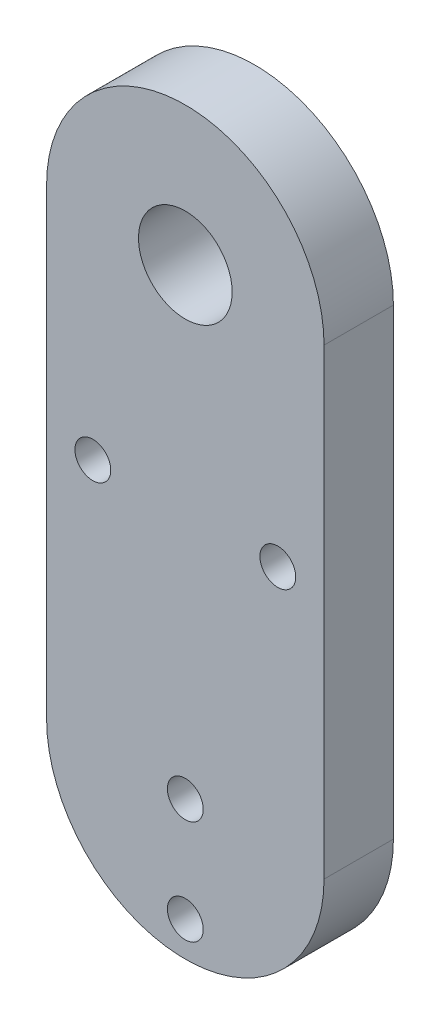
ISO-10303-21;
HEADER;
FILE_DESCRIPTION(('STEP AP214'),'2;1');
FILE_NAME('part.step','',(''),(''),'','','');
FILE_SCHEMA(('AUTOMOTIVE_DESIGN { 1 0 10303 214 1 1 1 1 }'));
ENDSEC;
DATA;
#1=APPLICATION_CONTEXT('core data for automotive mechanical design processes');
#2=APPLICATION_PROTOCOL_DEFINITION('international standard','automotive_design',2000,#1);
#3=PRODUCT_CONTEXT('',#1,'mechanical');
#4=PRODUCT('Part','Part','',(#3));
#5=PRODUCT_RELATED_PRODUCT_CATEGORY('part','',(#4));
#6=PRODUCT_DEFINITION_FORMATION('','',#4);
#7=PRODUCT_DEFINITION_CONTEXT('part definition',#1,'design');
#8=PRODUCT_DEFINITION('design','',#6,#7);
#9=PRODUCT_DEFINITION_SHAPE('','',#8);
#10=(LENGTH_UNIT() NAMED_UNIT(*) SI_UNIT(.MILLI.,.METRE.));
#11=(NAMED_UNIT(*) PLANE_ANGLE_UNIT() SI_UNIT($,.RADIAN.));
#12=(NAMED_UNIT(*) SI_UNIT($,.STERADIAN.) SOLID_ANGLE_UNIT());
#13=UNCERTAINTY_MEASURE_WITH_UNIT(LENGTH_MEASURE(1.E-05),#10,'distance_accuracy_value','');
#14=(GEOMETRIC_REPRESENTATION_CONTEXT(3) GLOBAL_UNCERTAINTY_ASSIGNED_CONTEXT((#13)) GLOBAL_UNIT_ASSIGNED_CONTEXT((#10,
#11,#12)) REPRESENTATION_CONTEXT('',''));
#15=CARTESIAN_POINT('',(0.,0.,0.));
#16=DIRECTION('',(0.,0.,1.));
#17=DIRECTION('',(1.,0.,0.));
#18=AXIS2_PLACEMENT_3D('',#15,#16,#17);
#19=CARTESIAN_POINT('',(-188.181077779291,116.924846476842,6.));
#20=DIRECTION('',(0.,0.,-1.));
#21=DIRECTION('',(-1.,0.,0.));
#22=AXIS2_PLACEMENT_3D('',#19,#20,#21);
#23=CYLINDRICAL_SURFACE('',#22,12.0000000000002);
#24=CARTESIAN_POINT('',(-188.181077779291,116.924846476842,0.));
#25=DIRECTION('',(0.,0.,1.));
#26=DIRECTION('',(1.,0.,0.));
#27=AXIS2_PLACEMENT_3D('',#24,#25,#26);
#28=CIRCLE('',#27,12.0000000000002);
#29=CARTESIAN_POINT('',(-176.181077779291,116.924844163406,0.));
#30=VERTEX_POINT('',#29);
#31=CARTESIAN_POINT('',(-200.181077779291,116.924844227523,0.));
#32=VERTEX_POINT('',#31);
#33=EDGE_CURVE('E99',#30,#32,#28,.T.);
#34=ORIENTED_EDGE('',*,*,#33,.T.);
#35=DIRECTION('',(0.,0.,-1.));
#36=VECTOR('',#35,1.);
#37=CARTESIAN_POINT('',(-200.181077779291,116.924844227523,6.));
#38=LINE('',#37,#36);
#39=CARTESIAN_POINT('',(-200.181077779291,116.924844227523,6.));
#40=VERTEX_POINT('',#39);
#41=EDGE_CURVE('E11',#40,#32,#38,.T.);
#42=ORIENTED_EDGE('',*,*,#41,.F.);
#43=CARTESIAN_POINT('',(-188.181077779291,116.924846476842,6.));
#44=DIRECTION('',(0.,0.,1.));
#45=DIRECTION('',(1.,0.,0.));
#46=AXIS2_PLACEMENT_3D('',#43,#44,#45);
#47=CIRCLE('',#46,12.0000000000002);
#48=CARTESIAN_POINT('',(-176.181077779291,116.924844163406,6.));
#49=VERTEX_POINT('',#48);
#50=EDGE_CURVE('E86',#49,#40,#47,.T.);
#51=ORIENTED_EDGE('',*,*,#50,.F.);
#52=DIRECTION('',(0.,0.,-1.));
#53=VECTOR('',#52,1.);
#54=CARTESIAN_POINT('',(-176.181077779291,116.924844163406,6.));
#55=LINE('',#54,#53);
#56=EDGE_CURVE('E95',#49,#30,#55,.T.);
#57=ORIENTED_EDGE('',*,*,#56,.T.);
#58=EDGE_LOOP('',(#34,#42,#51,#57));
#59=FACE_BOUND('',#58,.T.);
#60=ADVANCED_FACE('F34',(#59),#23,.T.);
#61=CARTESIAN_POINT('',(-200.181077779291,116.924844227523,6.));
#62=DIRECTION('',(1.,0.,0.));
#63=DIRECTION('',(0.,0.,-1.));
#64=AXIS2_PLACEMENT_3D('',#61,#62,#63);
#65=PLANE('',#64);
#66=DIRECTION('',(0.,-1.,0.));
#67=VECTOR('',#66,1.);
#68=CARTESIAN_POINT('',(-200.181077779291,116.924844227523,0.));
#69=LINE('',#68,#67);
#70=CARTESIAN_POINT('',(-200.181077779291,76.9248464768425,0.));
#71=VERTEX_POINT('',#70);
#72=EDGE_CURVE('E90',#32,#71,#69,.T.);
#73=ORIENTED_EDGE('',*,*,#72,.T.);
#74=DIRECTION('',(0.,0.,-1.));
#75=VECTOR('',#74,1.);
#76=CARTESIAN_POINT('',(-200.181077779291,76.9248464768425,6.));
#77=LINE('',#76,#75);
#78=CARTESIAN_POINT('',(-200.181077779291,76.9248464768425,6.));
#79=VERTEX_POINT('',#78);
#80=EDGE_CURVE('E43',#79,#71,#77,.T.);
#81=ORIENTED_EDGE('',*,*,#80,.F.);
#82=DIRECTION('',(0.,-1.,0.));
#83=VECTOR('',#82,1.);
#84=CARTESIAN_POINT('',(-200.181077779291,116.924844227523,6.));
#85=LINE('',#84,#83);
#86=EDGE_CURVE('E81',#40,#79,#85,.T.);
#87=ORIENTED_EDGE('',*,*,#86,.F.);
#88=ORIENTED_EDGE('',*,*,#41,.T.);
#89=EDGE_LOOP('',(#73,#81,#87,#88));
#90=FACE_BOUND('',#89,.T.);
#91=ADVANCED_FACE('F89',(#90),#65,.F.);
#92=CARTESIAN_POINT('',(-188.181077779291,76.9248464768425,6.));
#93=DIRECTION('',(0.,0.,-1.));
#94=DIRECTION('',(-1.,0.,0.));
#95=AXIS2_PLACEMENT_3D('',#92,#93,#94);
#96=CYLINDRICAL_SURFACE('',#95,12.);
#97=CARTESIAN_POINT('',(-188.181077779291,76.9248464768425,0.));
#98=DIRECTION('',(0.,0.,1.));
#99=DIRECTION('',(1.,0.,0.));
#100=AXIS2_PLACEMENT_3D('',#97,#98,#99);
#101=CIRCLE('',#100,12.);
#102=CARTESIAN_POINT('',(-176.181077779291,76.9248464768425,0.));
#103=VERTEX_POINT('',#102);
#104=EDGE_CURVE('E68',#71,#103,#101,.T.);
#105=ORIENTED_EDGE('',*,*,#104,.T.);
#106=DIRECTION('',(0.,0.,-1.));
#107=VECTOR('',#106,1.);
#108=CARTESIAN_POINT('',(-176.181077779291,76.9248464768425,6.));
#109=LINE('',#108,#107);
#110=CARTESIAN_POINT('',(-176.181077779291,76.9248464768425,6.));
#111=VERTEX_POINT('',#110);
#112=EDGE_CURVE('E91',#111,#103,#109,.T.);
#113=ORIENTED_EDGE('',*,*,#112,.F.);
#114=CARTESIAN_POINT('',(-188.181077779291,76.9248464768425,6.));
#115=DIRECTION('',(0.,0.,1.));
#116=DIRECTION('',(1.,0.,0.));
#117=AXIS2_PLACEMENT_3D('',#114,#115,#116);
#118=CIRCLE('',#117,12.);
#119=EDGE_CURVE('E84',#79,#111,#118,.T.);
#120=ORIENTED_EDGE('',*,*,#119,.F.);
#121=ORIENTED_EDGE('',*,*,#80,.T.);
#122=EDGE_LOOP('',(#105,#113,#120,#121));
#123=FACE_BOUND('',#122,.T.);
#124=ADVANCED_FACE('F93',(#123),#96,.T.);
#125=CARTESIAN_POINT('',(-176.181077779291,76.9248464768425,6.));
#126=DIRECTION('',(-1.,0.,0.));
#127=DIRECTION('',(0.,0.,1.));
#128=AXIS2_PLACEMENT_3D('',#125,#126,#127);
#129=PLANE('',#128);
#130=DIRECTION('',(0.,1.,0.));
#131=VECTOR('',#130,1.);
#132=CARTESIAN_POINT('',(-176.181077779291,76.9248464768425,0.));
#133=LINE('',#132,#131);
#134=EDGE_CURVE('E74',#103,#30,#133,.T.);
#135=ORIENTED_EDGE('',*,*,#134,.T.);
#136=ORIENTED_EDGE('',*,*,#56,.F.);
#137=DIRECTION('',(0.,1.,0.));
#138=VECTOR('',#137,1.);
#139=CARTESIAN_POINT('',(-176.181077779291,76.9248464768425,6.));
#140=LINE('',#139,#138);
#141=EDGE_CURVE('E51',#111,#49,#140,.T.);
#142=ORIENTED_EDGE('',*,*,#141,.F.);
#143=ORIENTED_EDGE('',*,*,#112,.T.);
#144=EDGE_LOOP('',(#135,#136,#142,#143));
#145=FACE_BOUND('',#144,.T.);
#146=ADVANCED_FACE('F107',(#145),#129,.F.);
#147=CARTESIAN_POINT('',(-188.181077779291,116.924846476842,6.));
#148=DIRECTION('',(0.,0.,1.));
#149=DIRECTION('',(1.,0.,0.));
#150=AXIS2_PLACEMENT_3D('',#147,#148,#149);
#151=PLANE('',#150);
#152=CARTESIAN_POINT('',(-188.181077779291,76.9248464768425,6.));
#153=DIRECTION('',(0.,0.,1.));
#154=DIRECTION('',(1.,0.,0.));
#155=AXIS2_PLACEMENT_3D('',#152,#153,#154);
#156=CIRCLE('',#155,1.54999999999999);
#157=CARTESIAN_POINT('',(-186.631077779291,76.9248464768425,6.));
#158=VERTEX_POINT('',#157);
#159=EDGE_CURVE('E136',#158,#158,#156,.T.);
#160=ORIENTED_EDGE('',*,*,#159,.F.);
#161=EDGE_LOOP('',(#160));
#162=FACE_BOUND('',#161,.T.);
#163=CARTESIAN_POINT('',(-188.181077779291,116.924846476842,6.));
#164=DIRECTION('',(0.,0.,1.));
#165=DIRECTION('',(1.,0.,0.));
#166=AXIS2_PLACEMENT_3D('',#163,#164,#165);
#167=CIRCLE('',#166,4.04999999999999);
#168=CARTESIAN_POINT('',(-184.131077779291,116.924846476842,6.));
#169=VERTEX_POINT('',#168);
#170=EDGE_CURVE('E131',#169,#169,#167,.T.);
#171=ORIENTED_EDGE('',*,*,#170,.F.);
#172=EDGE_LOOP('',(#171));
#173=FACE_BOUND('',#172,.T.);
#174=CARTESIAN_POINT('',(-180.1810777793,98.3248197947916,6.));
#175=DIRECTION('',(0.,0.,1.));
#176=DIRECTION('',(1.,0.,0.));
#177=AXIS2_PLACEMENT_3D('',#174,#175,#176);
#178=CIRCLE('',#177,1.55000000002475);
#179=CARTESIAN_POINT('',(-178.631077779276,98.3248197947916,6.));
#180=VERTEX_POINT('',#179);
#181=EDGE_CURVE('E125',#180,#180,#178,.T.);
#182=ORIENTED_EDGE('',*,*,#181,.F.);
#183=EDGE_LOOP('',(#182));
#184=FACE_BOUND('',#183,.T.);
#185=CARTESIAN_POINT('',(-196.1810777793,98.3248197947916,6.));
#186=DIRECTION('',(0.,0.,1.));
#187=DIRECTION('',(1.,0.,0.));
#188=AXIS2_PLACEMENT_3D('',#185,#186,#187);
#189=CIRCLE('',#188,1.55000000002475);
#190=CARTESIAN_POINT('',(-194.631077779276,98.3248197947916,6.));
#191=VERTEX_POINT('',#190);
#192=EDGE_CURVE('E119',#191,#191,#189,.T.);
#193=ORIENTED_EDGE('',*,*,#192,.F.);
#194=EDGE_LOOP('',(#193));
#195=FACE_BOUND('',#194,.T.);
#196=CARTESIAN_POINT('',(-188.1810777793,67.9248464767504,6.));
#197=DIRECTION('',(0.,0.,1.));
#198=DIRECTION('',(1.,0.,0.));
#199=AXIS2_PLACEMENT_3D('',#196,#197,#198);
#200=CIRCLE('',#199,1.54999999999999);
#201=CARTESIAN_POINT('',(-186.6310777793,67.9248464767504,6.));
#202=VERTEX_POINT('',#201);
#203=EDGE_CURVE('E113',#202,#202,#200,.T.);
#204=ORIENTED_EDGE('',*,*,#203,.F.);
#205=EDGE_LOOP('',(#204));
#206=FACE_BOUND('',#205,.T.);
#207=ORIENTED_EDGE('',*,*,#50,.T.);
#208=ORIENTED_EDGE('',*,*,#86,.T.);
#209=ORIENTED_EDGE('',*,*,#119,.T.);
#210=ORIENTED_EDGE('',*,*,#141,.T.);
#211=EDGE_LOOP('',(#207,#208,#209,#210));
#212=FACE_BOUND('',#211,.T.);
#213=ADVANCED_FACE('F82',(#162,#173,#184,#195,#206,#212),#151,.T.);
#214=CARTESIAN_POINT('',(-188.181077779291,116.924846476842,0.));
#215=DIRECTION('',(0.,0.,1.));
#216=DIRECTION('',(1.,0.,0.));
#217=AXIS2_PLACEMENT_3D('',#214,#215,#216);
#218=PLANE('',#217);
#219=CARTESIAN_POINT('',(-188.181077779291,76.9248464768425,0.));
#220=DIRECTION('',(0.,0.,1.));
#221=DIRECTION('',(1.,0.,0.));
#222=AXIS2_PLACEMENT_3D('',#219,#220,#221);
#223=CIRCLE('',#222,1.54999999999999);
#224=CARTESIAN_POINT('',(-186.631077779291,76.9248464768425,0.));
#225=VERTEX_POINT('',#224);
#226=EDGE_CURVE('E37',#225,#225,#223,.T.);
#227=ORIENTED_EDGE('',*,*,#226,.T.);
#228=EDGE_LOOP('',(#227));
#229=FACE_BOUND('',#228,.T.);
#230=CARTESIAN_POINT('',(-188.181077779291,116.924846476842,0.));
#231=DIRECTION('',(0.,0.,1.));
#232=DIRECTION('',(1.,0.,0.));
#233=AXIS2_PLACEMENT_3D('',#230,#231,#232);
#234=CIRCLE('',#233,4.04999999999999);
#235=CARTESIAN_POINT('',(-184.131077779291,116.924846476842,0.));
#236=VERTEX_POINT('',#235);
#237=EDGE_CURVE('E128',#236,#236,#234,.T.);
#238=ORIENTED_EDGE('',*,*,#237,.T.);
#239=EDGE_LOOP('',(#238));
#240=FACE_BOUND('',#239,.T.);
#241=CARTESIAN_POINT('',(-180.1810777793,98.3248197947916,0.));
#242=DIRECTION('',(0.,0.,1.));
#243=DIRECTION('',(1.,0.,0.));
#244=AXIS2_PLACEMENT_3D('',#241,#242,#243);
#245=CIRCLE('',#244,1.55000000002475);
#246=CARTESIAN_POINT('',(-178.631077779276,98.3248197947916,0.));
#247=VERTEX_POINT('',#246);
#248=EDGE_CURVE('E122',#247,#247,#245,.T.);
#249=ORIENTED_EDGE('',*,*,#248,.T.);
#250=EDGE_LOOP('',(#249));
#251=FACE_BOUND('',#250,.T.);
#252=CARTESIAN_POINT('',(-196.1810777793,98.3248197947916,0.));
#253=DIRECTION('',(0.,0.,1.));
#254=DIRECTION('',(1.,0.,0.));
#255=AXIS2_PLACEMENT_3D('',#252,#253,#254);
#256=CIRCLE('',#255,1.55000000002475);
#257=CARTESIAN_POINT('',(-194.631077779276,98.3248197947916,0.));
#258=VERTEX_POINT('',#257);
#259=EDGE_CURVE('E116',#258,#258,#256,.T.);
#260=ORIENTED_EDGE('',*,*,#259,.T.);
#261=EDGE_LOOP('',(#260));
#262=FACE_BOUND('',#261,.T.);
#263=CARTESIAN_POINT('',(-188.1810777793,67.9248464767504,0.));
#264=DIRECTION('',(0.,0.,1.));
#265=DIRECTION('',(1.,0.,0.));
#266=AXIS2_PLACEMENT_3D('',#263,#264,#265);
#267=CIRCLE('',#266,1.54999999999999);
#268=CARTESIAN_POINT('',(-186.6310777793,67.9248464767504,0.));
#269=VERTEX_POINT('',#268);
#270=EDGE_CURVE('E102',#269,#269,#267,.T.);
#271=ORIENTED_EDGE('',*,*,#270,.T.);
#272=EDGE_LOOP('',(#271));
#273=FACE_BOUND('',#272,.T.);
#274=ORIENTED_EDGE('',*,*,#33,.F.);
#275=ORIENTED_EDGE('',*,*,#134,.F.);
#276=ORIENTED_EDGE('',*,*,#104,.F.);
#277=ORIENTED_EDGE('',*,*,#72,.F.);
#278=EDGE_LOOP('',(#274,#275,#276,#277));
#279=FACE_BOUND('',#278,.T.);
#280=ADVANCED_FACE('F110',(#229,#240,#251,#262,#273,#279),#218,.F.);
#281=CARTESIAN_POINT('',(-188.1810777793,67.9248464767504,0.));
#282=DIRECTION('',(0.,0.,1.));
#283=DIRECTION('',(1.,0.,0.));
#284=AXIS2_PLACEMENT_3D('',#281,#282,#283);
#285=CYLINDRICAL_SURFACE('',#284,1.54999999999999);
#286=ORIENTED_EDGE('',*,*,#270,.F.);
#287=EDGE_LOOP('',(#286));
#288=FACE_BOUND('',#287,.T.);
#289=ORIENTED_EDGE('',*,*,#203,.T.);
#290=EDGE_LOOP('',(#289));
#291=FACE_BOUND('',#290,.T.);
#292=ADVANCED_FACE('F168',(#288,#291),#285,.F.);
#293=CARTESIAN_POINT('',(-196.1810777793,98.3248197947916,0.));
#294=DIRECTION('',(0.,0.,1.));
#295=DIRECTION('',(1.,0.,0.));
#296=AXIS2_PLACEMENT_3D('',#293,#294,#295);
#297=CYLINDRICAL_SURFACE('',#296,1.55000000002475);
#298=ORIENTED_EDGE('',*,*,#259,.F.);
#299=EDGE_LOOP('',(#298));
#300=FACE_BOUND('',#299,.T.);
#301=ORIENTED_EDGE('',*,*,#192,.T.);
#302=EDGE_LOOP('',(#301));
#303=FACE_BOUND('',#302,.T.);
#304=ADVANCED_FACE('F174',(#300,#303),#297,.F.);
#305=CARTESIAN_POINT('',(-180.1810777793,98.3248197947916,0.));
#306=DIRECTION('',(0.,0.,1.));
#307=DIRECTION('',(1.,0.,0.));
#308=AXIS2_PLACEMENT_3D('',#305,#306,#307);
#309=CYLINDRICAL_SURFACE('',#308,1.55000000002475);
#310=ORIENTED_EDGE('',*,*,#248,.F.);
#311=EDGE_LOOP('',(#310));
#312=FACE_BOUND('',#311,.T.);
#313=ORIENTED_EDGE('',*,*,#181,.T.);
#314=EDGE_LOOP('',(#313));
#315=FACE_BOUND('',#314,.T.);
#316=ADVANCED_FACE('F152',(#312,#315),#309,.F.);
#317=CARTESIAN_POINT('',(-188.181077779291,116.924846476842,0.));
#318=DIRECTION('',(0.,0.,1.));
#319=DIRECTION('',(1.,0.,0.));
#320=AXIS2_PLACEMENT_3D('',#317,#318,#319);
#321=CYLINDRICAL_SURFACE('',#320,4.04999999999999);
#322=ORIENTED_EDGE('',*,*,#237,.F.);
#323=EDGE_LOOP('',(#322));
#324=FACE_BOUND('',#323,.T.);
#325=ORIENTED_EDGE('',*,*,#170,.T.);
#326=EDGE_LOOP('',(#325));
#327=FACE_BOUND('',#326,.T.);
#328=ADVANCED_FACE('F147',(#324,#327),#321,.F.);
#329=CARTESIAN_POINT('',(-188.181077779291,76.9248464768425,-4.));
#330=DIRECTION('',(0.,0.,1.));
#331=DIRECTION('',(1.,0.,0.));
#332=AXIS2_PLACEMENT_3D('',#329,#330,#331);
#333=CYLINDRICAL_SURFACE('',#332,1.54999999999999);
#334=ORIENTED_EDGE('',*,*,#159,.T.);
#335=EDGE_LOOP('',(#334));
#336=FACE_BOUND('',#335,.T.);
#337=ORIENTED_EDGE('',*,*,#226,.F.);
#338=EDGE_LOOP('',(#337));
#339=FACE_BOUND('',#338,.T.);
#340=ADVANCED_FACE('F145',(#336,#339),#333,.F.);
#341=CLOSED_SHELL('',(#60,#91,#124,#146,#213,#280,#292,#304,#316,#328,#340));
#342=MANIFOLD_SOLID_BREP('B2',#341);
#343=ADVANCED_BREP_SHAPE_REPRESENTATION('',(#18,#342),#14);
#344=SHAPE_DEFINITION_REPRESENTATION(#9,#343);
ENDSEC;
END-ISO-10303-21;
